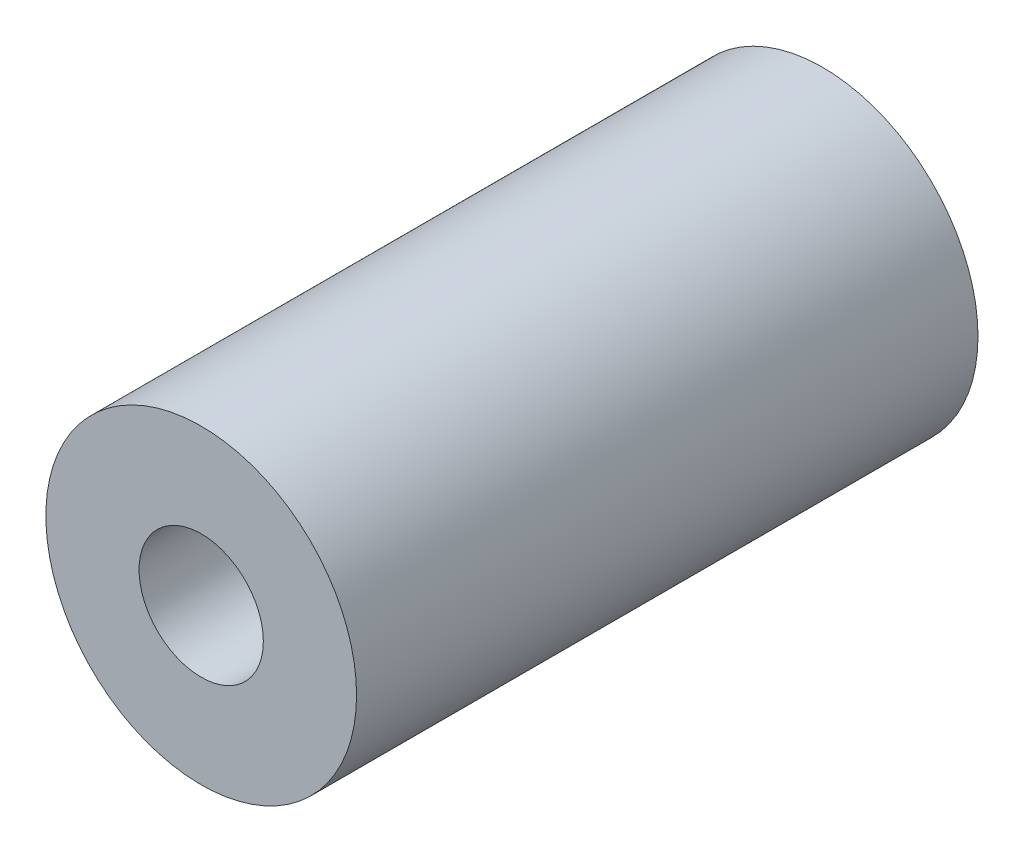
ISO-10303-21;
HEADER;
FILE_DESCRIPTION(('STEP AP214'),'2;1');
FILE_NAME('part.step','',(''),(''),'','','');
FILE_SCHEMA(('AUTOMOTIVE_DESIGN { 1 0 10303 214 1 1 1 1 }'));
ENDSEC;
DATA;
#1=APPLICATION_CONTEXT('core data for automotive mechanical design processes');
#2=APPLICATION_PROTOCOL_DEFINITION('international standard','automotive_design',2000,#1);
#3=PRODUCT_CONTEXT('',#1,'mechanical');
#4=PRODUCT('Part','Part','',(#3));
#5=PRODUCT_RELATED_PRODUCT_CATEGORY('part','',(#4));
#6=PRODUCT_DEFINITION_FORMATION('','',#4);
#7=PRODUCT_DEFINITION_CONTEXT('part definition',#1,'design');
#8=PRODUCT_DEFINITION('design','',#6,#7);
#9=PRODUCT_DEFINITION_SHAPE('','',#8);
#10=(LENGTH_UNIT() NAMED_UNIT(*) SI_UNIT(.MILLI.,.METRE.));
#11=(NAMED_UNIT(*) PLANE_ANGLE_UNIT() SI_UNIT($,.RADIAN.));
#12=(NAMED_UNIT(*) SI_UNIT($,.STERADIAN.) SOLID_ANGLE_UNIT());
#13=UNCERTAINTY_MEASURE_WITH_UNIT(LENGTH_MEASURE(1.E-05),#10,'distance_accuracy_value','');
#14=(GEOMETRIC_REPRESENTATION_CONTEXT(3) GLOBAL_UNCERTAINTY_ASSIGNED_CONTEXT((#13)) GLOBAL_UNIT_ASSIGNED_CONTEXT((#10,
#11,#12)) REPRESENTATION_CONTEXT('',''));
#15=CARTESIAN_POINT('',(0.,0.,0.));
#16=DIRECTION('',(0.,0.,1.));
#17=DIRECTION('',(1.,0.,0.));
#18=AXIS2_PLACEMENT_3D('',#15,#16,#17);
#19=CARTESIAN_POINT('',(0.,0.,31.75));
#20=DIRECTION('',(0.,0.,1.));
#21=DIRECTION('',(1.,0.,0.));
#22=AXIS2_PLACEMENT_3D('',#19,#20,#21);
#23=PLANE('',#22);
#24=CARTESIAN_POINT('',(0.,0.,31.75));
#25=DIRECTION('',(0.,0.,1.));
#26=DIRECTION('',(1.,0.,0.));
#27=AXIS2_PLACEMENT_3D('',#24,#25,#26);
#28=CIRCLE('',#27,7.9375);
#29=CARTESIAN_POINT('',(7.9375,0.,31.75));
#30=VERTEX_POINT('',#29);
#31=EDGE_CURVE('E10',#30,#30,#28,.T.);
#32=ORIENTED_EDGE('',*,*,#31,.T.);
#33=EDGE_LOOP('',(#32));
#34=FACE_BOUND('',#33,.T.);
#35=CARTESIAN_POINT('',(0.,0.,31.75));
#36=DIRECTION('',(0.,0.,1.));
#37=DIRECTION('',(1.,0.,0.));
#38=AXIS2_PLACEMENT_3D('',#35,#36,#37);
#39=CIRCLE('',#38,3.175);
#40=CARTESIAN_POINT('',(3.175,0.,31.75));
#41=VERTEX_POINT('',#40);
#42=EDGE_CURVE('E42',#41,#41,#39,.T.);
#43=ORIENTED_EDGE('',*,*,#42,.F.);
#44=EDGE_LOOP('',(#43));
#45=FACE_BOUND('',#44,.T.);
#46=ADVANCED_FACE('F31',(#34,#45),#23,.T.);
#47=CARTESIAN_POINT('',(0.,0.,0.));
#48=DIRECTION('',(0.,0.,1.));
#49=DIRECTION('',(1.,0.,0.));
#50=AXIS2_PLACEMENT_3D('',#47,#48,#49);
#51=PLANE('',#50);
#52=CARTESIAN_POINT('',(0.,0.,0.));
#53=DIRECTION('',(0.,0.,1.));
#54=DIRECTION('',(1.,0.,0.));
#55=AXIS2_PLACEMENT_3D('',#52,#53,#54);
#56=CIRCLE('',#55,7.9375);
#57=CARTESIAN_POINT('',(7.9375,0.,0.));
#58=VERTEX_POINT('',#57);
#59=EDGE_CURVE('E35',#58,#58,#56,.T.);
#60=ORIENTED_EDGE('',*,*,#59,.F.);
#61=EDGE_LOOP('',(#60));
#62=FACE_BOUND('',#61,.T.);
#63=CARTESIAN_POINT('',(0.,0.,0.));
#64=DIRECTION('',(0.,0.,1.));
#65=DIRECTION('',(1.,0.,0.));
#66=AXIS2_PLACEMENT_3D('',#63,#64,#65);
#67=CIRCLE('',#66,3.175);
#68=CARTESIAN_POINT('',(3.175,0.,0.));
#69=VERTEX_POINT('',#68);
#70=EDGE_CURVE('E44',#69,#69,#67,.T.);
#71=ORIENTED_EDGE('',*,*,#70,.T.);
#72=EDGE_LOOP('',(#71));
#73=FACE_BOUND('',#72,.T.);
#74=ADVANCED_FACE('F54',(#62,#73),#51,.F.);
#75=CARTESIAN_POINT('',(0.,0.,31.75));
#76=DIRECTION('',(0.,0.,-1.));
#77=DIRECTION('',(-1.,0.,0.));
#78=AXIS2_PLACEMENT_3D('',#75,#76,#77);
#79=CYLINDRICAL_SURFACE('',#78,7.9375);
#80=ORIENTED_EDGE('',*,*,#31,.F.);
#81=EDGE_LOOP('',(#80));
#82=FACE_BOUND('',#81,.T.);
#83=ORIENTED_EDGE('',*,*,#59,.T.);
#84=EDGE_LOOP('',(#83));
#85=FACE_BOUND('',#84,.T.);
#86=ADVANCED_FACE('F33',(#82,#85),#79,.T.);
#87=CARTESIAN_POINT('',(0.,0.,31.75));
#88=DIRECTION('',(0.,0.,-1.));
#89=DIRECTION('',(-1.,0.,0.));
#90=AXIS2_PLACEMENT_3D('',#87,#88,#89);
#91=CYLINDRICAL_SURFACE('',#90,3.175);
#92=ORIENTED_EDGE('',*,*,#42,.T.);
#93=EDGE_LOOP('',(#92));
#94=FACE_BOUND('',#93,.T.);
#95=ORIENTED_EDGE('',*,*,#70,.F.);
#96=EDGE_LOOP('',(#95));
#97=FACE_BOUND('',#96,.T.);
#98=ADVANCED_FACE('F50',(#94,#97),#91,.F.);
#99=CLOSED_SHELL('',(#46,#74,#86,#98));
#100=MANIFOLD_SOLID_BREP('B2',#99);
#101=ADVANCED_BREP_SHAPE_REPRESENTATION('',(#18,#100),#14);
#102=SHAPE_DEFINITION_REPRESENTATION(#9,#101);
ENDSEC;
END-ISO-10303-21;
